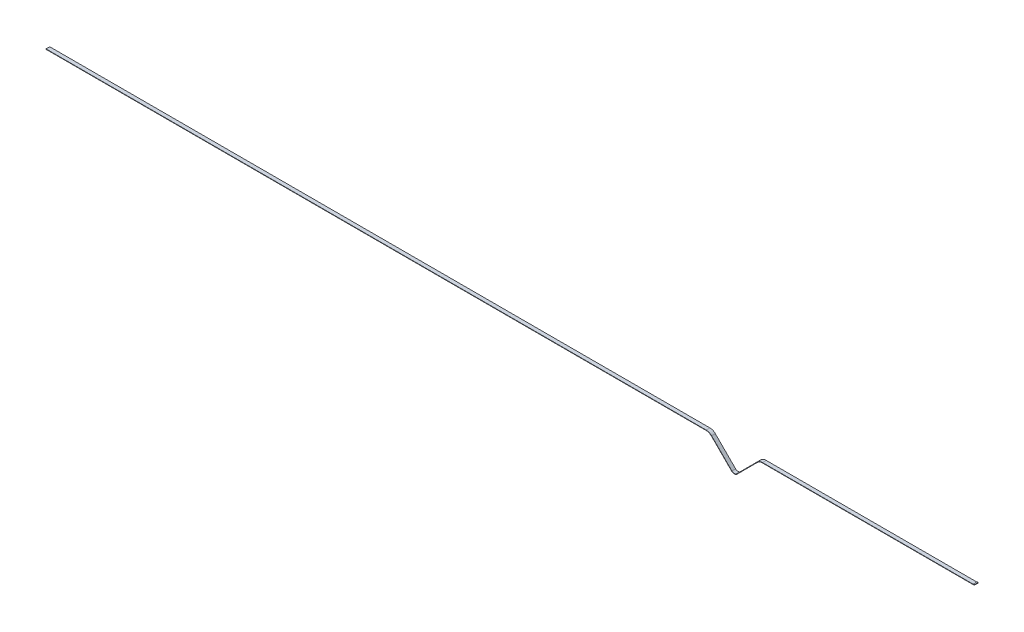
ISO-10303-21;
HEADER;
FILE_DESCRIPTION(('STEP AP214'),'2;1');
FILE_NAME('part.step','',(''),(''),'','','');
FILE_SCHEMA(('AUTOMOTIVE_DESIGN { 1 0 10303 214 1 1 1 1 }'));
ENDSEC;
DATA;
#1=APPLICATION_CONTEXT('core data for automotive mechanical design processes');
#2=APPLICATION_PROTOCOL_DEFINITION('international standard','automotive_design',2000,#1);
#3=PRODUCT_CONTEXT('',#1,'mechanical');
#4=PRODUCT('Part','Part','',(#3));
#5=PRODUCT_RELATED_PRODUCT_CATEGORY('part','',(#4));
#6=PRODUCT_DEFINITION_FORMATION('','',#4);
#7=PRODUCT_DEFINITION_CONTEXT('part definition',#1,'design');
#8=PRODUCT_DEFINITION('design','',#6,#7);
#9=PRODUCT_DEFINITION_SHAPE('','',#8);
#10=(LENGTH_UNIT() NAMED_UNIT(*) SI_UNIT(.MILLI.,.METRE.));
#11=(NAMED_UNIT(*) PLANE_ANGLE_UNIT() SI_UNIT($,.RADIAN.));
#12=(NAMED_UNIT(*) SI_UNIT($,.STERADIAN.) SOLID_ANGLE_UNIT());
#13=UNCERTAINTY_MEASURE_WITH_UNIT(LENGTH_MEASURE(1.E-05),#10,'distance_accuracy_value','');
#14=(GEOMETRIC_REPRESENTATION_CONTEXT(3) GLOBAL_UNCERTAINTY_ASSIGNED_CONTEXT((#13)) GLOBAL_UNIT_ASSIGNED_CONTEXT((#10,
#11,#12)) REPRESENTATION_CONTEXT('',''));
#15=CARTESIAN_POINT('',(0.,0.,0.));
#16=DIRECTION('',(0.,0.,1.));
#17=DIRECTION('',(1.,0.,0.));
#18=AXIS2_PLACEMENT_3D('',#15,#16,#17);
#19=CARTESIAN_POINT('',(0.,0.,0.));
#20=DIRECTION('',(-1.,0.,0.));
#21=DIRECTION('',(0.,0.,1.));
#22=AXIS2_PLACEMENT_3D('',#19,#20,#21);
#23=PLANE('',#22);
#24=DIRECTION('',(0.,-1.,0.));
#25=VECTOR('',#24,1.);
#26=CARTESIAN_POINT('',(0.,0.,0.));
#27=LINE('',#26,#25);
#28=CARTESIAN_POINT('',(0.,0.63,0.));
#29=VERTEX_POINT('',#28);
#30=CARTESIAN_POINT('',(0.,0.,0.));
#31=VERTEX_POINT('',#30);
#32=EDGE_CURVE('E247',#29,#31,#27,.T.);
#33=ORIENTED_EDGE('',*,*,#32,.T.);
#34=DIRECTION('',(0.,0.,-1.));
#35=VECTOR('',#34,1.);
#36=CARTESIAN_POINT('',(0.,0.,0.));
#37=LINE('',#36,#35);
#38=CARTESIAN_POINT('',(0.,0.,-6.));
#39=VERTEX_POINT('',#38);
#40=EDGE_CURVE('E181',#31,#39,#37,.T.);
#41=ORIENTED_EDGE('',*,*,#40,.T.);
#42=DIRECTION('',(0.,1.,0.));
#43=VECTOR('',#42,1.);
#44=CARTESIAN_POINT('',(0.,0.,-6.));
#45=LINE('',#44,#43);
#46=CARTESIAN_POINT('',(0.,0.63,-6.));
#47=VERTEX_POINT('',#46);
#48=EDGE_CURVE('E167',#39,#47,#45,.T.);
#49=ORIENTED_EDGE('',*,*,#48,.T.);
#50=DIRECTION('',(0.,0.,1.));
#51=VECTOR('',#50,1.);
#52=CARTESIAN_POINT('',(0.,0.63,0.));
#53=LINE('',#52,#51);
#54=EDGE_CURVE('E156',#47,#29,#53,.T.);
#55=ORIENTED_EDGE('',*,*,#54,.T.);
#56=EDGE_LOOP('',(#33,#41,#49,#55));
#57=FACE_BOUND('',#56,.T.);
#58=ADVANCED_FACE('F33',(#57),#23,.F.);
#59=CARTESIAN_POINT('',(-1500.,-1.73797688063286E-13,0.));
#60=DIRECTION('',(-1.,0.,0.));
#61=DIRECTION('',(0.,0.,1.));
#62=AXIS2_PLACEMENT_3D('',#59,#60,#61);
#63=PLANE('',#62);
#64=DIRECTION('',(0.,-1.,0.));
#65=VECTOR('',#64,1.);
#66=CARTESIAN_POINT('',(-1500.,-1.73797688063286E-13,0.));
#67=LINE('',#66,#65);
#68=CARTESIAN_POINT('',(-1500.,0.629999999999826,0.));
#69=VERTEX_POINT('',#68);
#70=CARTESIAN_POINT('',(-1500.,-1.73797688063286E-13,0.));
#71=VERTEX_POINT('',#70);
#72=EDGE_CURVE('E55',#69,#71,#67,.T.);
#73=ORIENTED_EDGE('',*,*,#72,.F.);
#74=DIRECTION('',(0.,0.,1.));
#75=VECTOR('',#74,1.);
#76=CARTESIAN_POINT('',(-1500.,0.629999999999826,0.));
#77=LINE('',#76,#75);
#78=CARTESIAN_POINT('',(-1500.,0.629999999999826,-6.));
#79=VERTEX_POINT('',#78);
#80=EDGE_CURVE('E243',#79,#69,#77,.T.);
#81=ORIENTED_EDGE('',*,*,#80,.F.);
#82=DIRECTION('',(0.,1.,0.));
#83=VECTOR('',#82,1.);
#84=CARTESIAN_POINT('',(-1500.,-1.73797688063286E-13,-6.));
#85=LINE('',#84,#83);
#86=CARTESIAN_POINT('',(-1500.,-1.73797688063286E-13,-6.));
#87=VERTEX_POINT('',#86);
#88=EDGE_CURVE('E237',#87,#79,#85,.T.);
#89=ORIENTED_EDGE('',*,*,#88,.F.);
#90=DIRECTION('',(0.,0.,-1.));
#91=VECTOR('',#90,1.);
#92=CARTESIAN_POINT('',(-1500.,-1.73797688063286E-13,0.));
#93=LINE('',#92,#91);
#94=EDGE_CURVE('E11',#71,#87,#93,.T.);
#95=ORIENTED_EDGE('',*,*,#94,.F.);
#96=EDGE_LOOP('',(#73,#81,#89,#95));
#97=FACE_BOUND('',#96,.T.);
#98=ADVANCED_FACE('F367',(#97),#63,.T.);
#99=CARTESIAN_POINT('',(0.,0.,-6.));
#100=DIRECTION('',(0.,0.,1.));
#101=DIRECTION('',(1.,0.,0.));
#102=AXIS2_PLACEMENT_3D('',#99,#100,#101);
#103=PLANE('',#102);
#104=DIRECTION('',(-1.,0.,0.));
#105=VECTOR('',#104,1.);
#106=CARTESIAN_POINT('',(0.,0.63,-6.));
#107=LINE('',#106,#105);
#108=CARTESIAN_POINT('',(-1.5,0.63,-6.));
#109=VERTEX_POINT('',#108);
#110=CARTESIAN_POINT('',(-342.201861120125,0.629999999999958,-6.));
#111=VERTEX_POINT('',#110);
#112=EDGE_CURVE('E164',#109,#111,#107,.T.);
#113=ORIENTED_EDGE('',*,*,#112,.F.);
#114=CARTESIAN_POINT('',(-0.75,0.63,-6.));
#115=DIRECTION('',(0.,0.,1.));
#116=DIRECTION('',(1.,0.,0.));
#117=AXIS2_PLACEMENT_3D('',#114,#115,#116);
#118=CIRCLE('',#117,0.75);
#119=EDGE_CURVE('E150',#47,#109,#118,.T.);
#120=ORIENTED_EDGE('',*,*,#119,.F.);
#121=ORIENTED_EDGE('',*,*,#48,.F.);
#122=DIRECTION('',(-1.,0.,0.));
#123=VECTOR('',#122,1.);
#124=CARTESIAN_POINT('',(0.,0.,-6.));
#125=LINE('',#124,#123);
#126=CARTESIAN_POINT('',(-342.201861120125,0.,-6.));
#127=VERTEX_POINT('',#126);
#128=EDGE_CURVE('E176',#39,#127,#125,.T.);
#129=ORIENTED_EDGE('',*,*,#128,.T.);
#130=DIRECTION('',(0.,1.,0.));
#131=VECTOR('',#130,1.);
#132=CARTESIAN_POINT('',(-342.201861120125,0.,-6.));
#133=LINE('',#132,#131);
#134=EDGE_CURVE('E172',#127,#111,#133,.T.);
#135=ORIENTED_EDGE('',*,*,#134,.T.);
#136=EDGE_LOOP('',(#113,#120,#121,#129,#135));
#137=FACE_BOUND('',#136,.T.);
#138=ADVANCED_FACE('F170',(#137),#103,.F.);
#139=CARTESIAN_POINT('',(0.,0.63,0.));
#140=DIRECTION('',(0.,-1.,0.));
#141=DIRECTION('',(1.,0.,0.));
#142=AXIS2_PLACEMENT_3D('',#139,#140,#141);
#143=PLANE('',#142);
#144=DIRECTION('',(-1.,0.,0.));
#145=VECTOR('',#144,1.);
#146=CARTESIAN_POINT('',(0.,0.63,0.));
#147=LINE('',#146,#145);
#148=CARTESIAN_POINT('',(-1.5,0.63,0.));
#149=VERTEX_POINT('',#148);
#150=CARTESIAN_POINT('',(-342.201861120125,0.629999999999958,0.));
#151=VERTEX_POINT('',#150);
#152=EDGE_CURVE('E166',#149,#151,#147,.T.);
#153=ORIENTED_EDGE('',*,*,#152,.F.);
#154=DIRECTION('',(0.,0.,1.));
#155=VECTOR('',#154,1.);
#156=CARTESIAN_POINT('',(-1.5,0.63,-6.));
#157=LINE('',#156,#155);
#158=EDGE_CURVE('E153',#109,#149,#157,.T.);
#159=ORIENTED_EDGE('',*,*,#158,.F.);
#160=ORIENTED_EDGE('',*,*,#112,.T.);
#161=DIRECTION('',(0.,0.,1.));
#162=VECTOR('',#161,1.);
#163=CARTESIAN_POINT('',(-342.201861120125,0.629999999999958,0.));
#164=LINE('',#163,#162);
#165=EDGE_CURVE('E173',#111,#151,#164,.T.);
#166=ORIENTED_EDGE('',*,*,#165,.T.);
#167=EDGE_LOOP('',(#153,#159,#160,#166));
#168=FACE_BOUND('',#167,.T.);
#169=ADVANCED_FACE('F162',(#168),#143,.F.);
#170=CARTESIAN_POINT('',(0.,0.,0.));
#171=DIRECTION('',(0.,0.,-1.));
#172=DIRECTION('',(-1.,0.,0.));
#173=AXIS2_PLACEMENT_3D('',#170,#171,#172);
#174=PLANE('',#173);
#175=DIRECTION('',(0.,-1.,0.));
#176=VECTOR('',#175,1.);
#177=CARTESIAN_POINT('',(-342.201861120125,0.,0.));
#178=LINE('',#177,#176);
#179=CARTESIAN_POINT('',(-342.201861120125,0.,0.));
#180=VERTEX_POINT('',#179);
#181=EDGE_CURVE('E250',#151,#180,#178,.T.);
#182=ORIENTED_EDGE('',*,*,#181,.T.);
#183=DIRECTION('',(-1.,0.,0.));
#184=VECTOR('',#183,1.);
#185=CARTESIAN_POINT('',(0.,0.,0.));
#186=LINE('',#185,#184);
#187=EDGE_CURVE('E288',#31,#180,#186,.T.);
#188=ORIENTED_EDGE('',*,*,#187,.F.);
#189=ORIENTED_EDGE('',*,*,#32,.F.);
#190=CARTESIAN_POINT('',(-0.75,0.63,0.));
#191=DIRECTION('',(0.,0.,1.));
#192=DIRECTION('',(1.,0.,0.));
#193=AXIS2_PLACEMENT_3D('',#190,#191,#192);
#194=CIRCLE('',#193,0.75);
#195=EDGE_CURVE('E47',#29,#149,#194,.T.);
#196=ORIENTED_EDGE('',*,*,#195,.T.);
#197=ORIENTED_EDGE('',*,*,#152,.T.);
#198=EDGE_LOOP('',(#182,#188,#189,#196,#197));
#199=FACE_BOUND('',#198,.T.);
#200=ADVANCED_FACE('F415',(#199),#174,.F.);
#201=CARTESIAN_POINT('',(0.,0.,0.));
#202=DIRECTION('',(0.,1.,0.));
#203=DIRECTION('',(-1.,0.,0.));
#204=AXIS2_PLACEMENT_3D('',#201,#202,#203);
#205=PLANE('',#204);
#206=DIRECTION('',(0.,0.,-1.));
#207=VECTOR('',#206,1.);
#208=CARTESIAN_POINT('',(-342.201861120125,0.,0.));
#209=LINE('',#208,#207);
#210=EDGE_CURVE('E192',#180,#127,#209,.T.);
#211=ORIENTED_EDGE('',*,*,#210,.T.);
#212=ORIENTED_EDGE('',*,*,#128,.F.);
#213=ORIENTED_EDGE('',*,*,#40,.F.);
#214=ORIENTED_EDGE('',*,*,#187,.T.);
#215=EDGE_LOOP('',(#211,#212,#213,#214));
#216=FACE_BOUND('',#215,.T.);
#217=ADVANCED_FACE('F408',(#216),#205,.F.);
#218=CARTESIAN_POINT('',(-342.201861120126,0.,-6.));
#219=DIRECTION('',(0.,0.,1.));
#220=DIRECTION('',(1.,0.,0.));
#221=AXIS2_PLACEMENT_3D('',#218,#219,#220);
#222=PLANE('',#221);
#223=CARTESIAN_POINT('',(-342.201861120126,-11.9499999999934,-6.));
#224=DIRECTION('',(0.,0.,1.));
#225=DIRECTION('',(0.,1.,0.));
#226=AXIS2_PLACEMENT_3D('',#223,#224,#225);
#227=CIRCLE('',#226,12.5799999999933);
#228=CARTESIAN_POINT('',(-351.10277855022,-3.06011423568368,-6.));
#229=VERTEX_POINT('',#228);
#230=EDGE_CURVE('E185',#111,#229,#227,.T.);
#231=ORIENTED_EDGE('',*,*,#230,.F.);
#232=ORIENTED_EDGE('',*,*,#134,.F.);
#233=CARTESIAN_POINT('',(-342.201861120126,-11.9499999999934,-6.));
#234=DIRECTION('',(0.,0.,1.));
#235=DIRECTION('',(0.,1.,0.));
#236=AXIS2_PLACEMENT_3D('',#233,#234,#235);
#237=CIRCLE('',#236,11.9499999999933);
#238=CARTESIAN_POINT('',(-350.657025133609,-3.50531519208416,-6.));
#239=VERTEX_POINT('',#238);
#240=EDGE_CURVE('E186',#127,#239,#237,.T.);
#241=ORIENTED_EDGE('',*,*,#240,.T.);
#242=DIRECTION('',(-0.707545105731241,0.70666818476267,0.));
#243=VECTOR('',#242,1.);
#244=CARTESIAN_POINT('',(-350.657025133609,-3.50531519208416,-6.));
#245=LINE('',#244,#243);
#246=EDGE_CURVE('E182',#239,#229,#245,.T.);
#247=ORIENTED_EDGE('',*,*,#246,.T.);
#248=EDGE_LOOP('',(#231,#232,#241,#247));
#249=FACE_BOUND('',#248,.T.);
#250=ADVANCED_FACE('F406',(#249),#222,.F.);
#251=CARTESIAN_POINT('',(-342.201861120126,-11.9499999999934,0.));
#252=DIRECTION('',(0.,0.,1.));
#253=DIRECTION('',(1.,0.,0.));
#254=AXIS2_PLACEMENT_3D('',#251,#252,#253);
#255=CYLINDRICAL_SURFACE('',#254,12.5799999999933);
#256=CARTESIAN_POINT('',(-342.201861120126,-11.9499999999934,0.));
#257=DIRECTION('',(0.,0.,1.));
#258=DIRECTION('',(0.,1.,0.));
#259=AXIS2_PLACEMENT_3D('',#256,#257,#258);
#260=CIRCLE('',#259,12.5799999999933);
#261=CARTESIAN_POINT('',(-351.10277855022,-3.06011423568368,0.));
#262=VERTEX_POINT('',#261);
#263=EDGE_CURVE('E253',#151,#262,#260,.T.);
#264=ORIENTED_EDGE('',*,*,#263,.F.);
#265=ORIENTED_EDGE('',*,*,#165,.F.);
#266=ORIENTED_EDGE('',*,*,#230,.T.);
#267=DIRECTION('',(0.,0.,1.));
#268=VECTOR('',#267,1.);
#269=CARTESIAN_POINT('',(-351.10277855022,-3.06011423568367,0.));
#270=LINE('',#269,#268);
#271=EDGE_CURVE('E189',#229,#262,#270,.T.);
#272=ORIENTED_EDGE('',*,*,#271,.T.);
#273=EDGE_LOOP('',(#264,#265,#266,#272));
#274=FACE_BOUND('',#273,.T.);
#275=ADVANCED_FACE('F404',(#274),#255,.T.);
#276=CARTESIAN_POINT('',(-342.201861120126,0.,0.));
#277=DIRECTION('',(0.,0.,-1.));
#278=DIRECTION('',(-1.,0.,0.));
#279=AXIS2_PLACEMENT_3D('',#276,#277,#278);
#280=PLANE('',#279);
#281=CARTESIAN_POINT('',(-342.201861120126,-11.9499999999934,0.));
#282=DIRECTION('',(0.,0.,1.));
#283=DIRECTION('',(0.,1.,0.));
#284=AXIS2_PLACEMENT_3D('',#281,#282,#283);
#285=CIRCLE('',#284,11.9499999999933);
#286=CARTESIAN_POINT('',(-350.657025133609,-3.50531519208416,0.));
#287=VERTEX_POINT('',#286);
#288=EDGE_CURVE('E292',#180,#287,#285,.T.);
#289=ORIENTED_EDGE('',*,*,#288,.F.);
#290=ORIENTED_EDGE('',*,*,#181,.F.);
#291=ORIENTED_EDGE('',*,*,#263,.T.);
#292=DIRECTION('',(0.707545105731241,-0.70666818476267,0.));
#293=VECTOR('',#292,1.);
#294=CARTESIAN_POINT('',(-350.657025133609,-3.50531519208416,0.));
#295=LINE('',#294,#293);
#296=EDGE_CURVE('E256',#262,#287,#295,.T.);
#297=ORIENTED_EDGE('',*,*,#296,.T.);
#298=EDGE_LOOP('',(#289,#290,#291,#297));
#299=FACE_BOUND('',#298,.T.);
#300=ADVANCED_FACE('F395',(#299),#280,.F.);
#301=CARTESIAN_POINT('',(-342.201861120126,-11.9499999999934,0.));
#302=DIRECTION('',(0.,0.,1.));
#303=DIRECTION('',(1.,0.,0.));
#304=AXIS2_PLACEMENT_3D('',#301,#302,#303);
#305=CYLINDRICAL_SURFACE('',#304,11.9499999999933);
#306=DIRECTION('',(0.,0.,-1.));
#307=VECTOR('',#306,1.);
#308=CARTESIAN_POINT('',(-350.657025133609,-3.50531519208416,0.));
#309=LINE('',#308,#307);
#310=EDGE_CURVE('E203',#287,#239,#309,.T.);
#311=ORIENTED_EDGE('',*,*,#310,.T.);
#312=ORIENTED_EDGE('',*,*,#240,.F.);
#313=ORIENTED_EDGE('',*,*,#210,.F.);
#314=ORIENTED_EDGE('',*,*,#288,.T.);
#315=EDGE_LOOP('',(#311,#312,#313,#314));
#316=FACE_BOUND('',#315,.T.);
#317=ADVANCED_FACE('F389',(#316),#305,.F.);
#318=CARTESIAN_POINT('',(-350.657025133609,-3.50531519208414,-6.));
#319=DIRECTION('',(0.,0.,1.));
#320=DIRECTION('',(1.,0.,0.));
#321=AXIS2_PLACEMENT_3D('',#318,#319,#320);
#322=PLANE('',#321);
#323=DIRECTION('',(-0.706668184762671,-0.70754510573124,0.));
#324=VECTOR('',#323,1.);
#325=CARTESIAN_POINT('',(-351.10277855022,-3.06011423568366,-6.));
#326=LINE('',#325,#324);
#327=CARTESIAN_POINT('',(-383.89451394072,-35.8925416524838,-6.));
#328=VERTEX_POINT('',#327);
#329=EDGE_CURVE('E196',#229,#328,#326,.T.);
#330=ORIENTED_EDGE('',*,*,#329,.F.);
#331=ORIENTED_EDGE('',*,*,#246,.F.);
#332=DIRECTION('',(-0.706668184762671,-0.70754510573124,0.));
#333=VECTOR('',#332,1.);
#334=CARTESIAN_POINT('',(-350.657025133609,-3.50531519208414,-6.));
#335=LINE('',#334,#333);
#336=CARTESIAN_POINT('',(-383.448760524109,-36.3377426088843,-6.));
#337=VERTEX_POINT('',#336);
#338=EDGE_CURVE('E197',#239,#337,#335,.T.);
#339=ORIENTED_EDGE('',*,*,#338,.T.);
#340=DIRECTION('',(-0.70754510573124,0.706668184762671,0.));
#341=VECTOR('',#340,1.);
#342=CARTESIAN_POINT('',(-383.448760524109,-36.3377426088843,-6.));
#343=LINE('',#342,#341);
#344=EDGE_CURVE('E193',#337,#328,#343,.T.);
#345=ORIENTED_EDGE('',*,*,#344,.T.);
#346=EDGE_LOOP('',(#330,#331,#339,#345));
#347=FACE_BOUND('',#346,.T.);
#348=ADVANCED_FACE('F383',(#347),#322,.F.);
#349=CARTESIAN_POINT('',(-351.10277855022,-3.06011423568366,0.));
#350=DIRECTION('',(0.707545105731241,-0.706668184762671,0.));
#351=DIRECTION('',(0.706668184762671,0.70754510573124,0.));
#352=AXIS2_PLACEMENT_3D('',#349,#350,#351);
#353=PLANE('',#352);
#354=DIRECTION('',(-0.706668184762671,-0.70754510573124,0.));
#355=VECTOR('',#354,1.);
#356=CARTESIAN_POINT('',(-351.10277855022,-3.06011423568366,0.));
#357=LINE('',#356,#355);
#358=CARTESIAN_POINT('',(-383.89451394072,-35.8925416524838,0.));
#359=VERTEX_POINT('',#358);
#360=EDGE_CURVE('E259',#262,#359,#357,.T.);
#361=ORIENTED_EDGE('',*,*,#360,.F.);
#362=ORIENTED_EDGE('',*,*,#271,.F.);
#363=ORIENTED_EDGE('',*,*,#329,.T.);
#364=DIRECTION('',(0.,0.,1.));
#365=VECTOR('',#364,1.);
#366=CARTESIAN_POINT('',(-383.89451394072,-35.8925416524838,0.));
#367=LINE('',#366,#365);
#368=EDGE_CURVE('E200',#328,#359,#367,.T.);
#369=ORIENTED_EDGE('',*,*,#368,.T.);
#370=EDGE_LOOP('',(#361,#362,#363,#369));
#371=FACE_BOUND('',#370,.T.);
#372=ADVANCED_FACE('F401',(#371),#353,.F.);
#373=CARTESIAN_POINT('',(-350.657025133609,-3.50531519208414,0.));
#374=DIRECTION('',(0.,0.,-1.));
#375=DIRECTION('',(-1.,0.,0.));
#376=AXIS2_PLACEMENT_3D('',#373,#374,#375);
#377=PLANE('',#376);
#378=DIRECTION('',(-0.706668184762671,-0.70754510573124,0.));
#379=VECTOR('',#378,1.);
#380=CARTESIAN_POINT('',(-350.657025133609,-3.50531519208414,0.));
#381=LINE('',#380,#379);
#382=CARTESIAN_POINT('',(-383.448760524109,-36.3377426088843,0.));
#383=VERTEX_POINT('',#382);
#384=EDGE_CURVE('E297',#287,#383,#381,.T.);
#385=ORIENTED_EDGE('',*,*,#384,.F.);
#386=ORIENTED_EDGE('',*,*,#296,.F.);
#387=ORIENTED_EDGE('',*,*,#360,.T.);
#388=DIRECTION('',(0.70754510573124,-0.706668184762671,0.));
#389=VECTOR('',#388,1.);
#390=CARTESIAN_POINT('',(-383.448760524109,-36.3377426088843,0.));
#391=LINE('',#390,#389);
#392=EDGE_CURVE('E262',#359,#383,#391,.T.);
#393=ORIENTED_EDGE('',*,*,#392,.T.);
#394=EDGE_LOOP('',(#385,#386,#387,#393));
#395=FACE_BOUND('',#394,.T.);
#396=ADVANCED_FACE('F398',(#395),#377,.F.);
#397=CARTESIAN_POINT('',(-350.657025133609,-3.50531519208414,0.));
#398=DIRECTION('',(-0.707545105731241,0.706668184762671,0.));
#399=DIRECTION('',(-0.706668184762671,-0.70754510573124,0.));
#400=AXIS2_PLACEMENT_3D('',#397,#398,#399);
#401=PLANE('',#400);
#402=DIRECTION('',(0.,0.,-1.));
#403=VECTOR('',#402,1.);
#404=CARTESIAN_POINT('',(-383.448760524109,-36.3377426088843,0.));
#405=LINE('',#404,#403);
#406=EDGE_CURVE('E214',#383,#337,#405,.T.);
#407=ORIENTED_EDGE('',*,*,#406,.T.);
#408=ORIENTED_EDGE('',*,*,#338,.F.);
#409=ORIENTED_EDGE('',*,*,#310,.F.);
#410=ORIENTED_EDGE('',*,*,#384,.T.);
#411=EDGE_LOOP('',(#407,#408,#409,#410));
#412=FACE_BOUND('',#411,.T.);
#413=ADVANCED_FACE('F386',(#412),#401,.F.);
#414=CARTESIAN_POINT('',(-383.448760524109,-36.3377426088843,-6.));
#415=DIRECTION('',(0.,0.,1.));
#416=DIRECTION('',(1.,0.,0.));
#417=AXIS2_PLACEMENT_3D('',#414,#415,#416);
#418=PLANE('',#417);
#419=CARTESIAN_POINT('',(-387.771861120127,-32.0199999999844,-6.));
#420=DIRECTION('',(0.,0.,-1.));
#421=DIRECTION('',(0.707545105731238,-0.706668184762673,0.));
#422=AXIS2_PLACEMENT_3D('',#419,#420,#421);
#423=CIRCLE('',#422,5.48);
#424=CARTESIAN_POINT('',(-391.649208299535,-35.8925416524836,-6.));
#425=VERTEX_POINT('',#424);
#426=EDGE_CURVE('E207',#328,#425,#423,.T.);
#427=ORIENTED_EDGE('',*,*,#426,.F.);
#428=ORIENTED_EDGE('',*,*,#344,.F.);
#429=CARTESIAN_POINT('',(-387.771861120127,-32.0199999999844,-6.));
#430=DIRECTION('',(0.,0.,-1.));
#431=DIRECTION('',(0.707545105731238,-0.706668184762673,0.));
#432=AXIS2_PLACEMENT_3D('',#429,#430,#431);
#433=CIRCLE('',#432,6.11000000000001);
#434=CARTESIAN_POINT('',(-392.094961716145,-36.337742608884,-6.));
#435=VERTEX_POINT('',#434);
#436=EDGE_CURVE('E208',#337,#435,#433,.T.);
#437=ORIENTED_EDGE('',*,*,#436,.T.);
#438=DIRECTION('',(0.707545105731281,0.706668184762629,0.));
#439=VECTOR('',#438,1.);
#440=CARTESIAN_POINT('',(-392.094961716145,-36.3377426088841,-6.));
#441=LINE('',#440,#439);
#442=EDGE_CURVE('E204',#435,#425,#441,.T.);
#443=ORIENTED_EDGE('',*,*,#442,.T.);
#444=EDGE_LOOP('',(#427,#428,#437,#443));
#445=FACE_BOUND('',#444,.T.);
#446=ADVANCED_FACE('F380',(#445),#418,.F.);
#447=CARTESIAN_POINT('',(-387.771861120127,-32.0199999999844,0.));
#448=DIRECTION('',(0.,0.,-1.));
#449=DIRECTION('',(-1.,0.,0.));
#450=AXIS2_PLACEMENT_3D('',#447,#448,#449);
#451=CYLINDRICAL_SURFACE('',#450,5.48);
#452=CARTESIAN_POINT('',(-387.771861120127,-32.0199999999844,0.));
#453=DIRECTION('',(0.,0.,-1.));
#454=DIRECTION('',(0.707545105731238,-0.706668184762673,0.));
#455=AXIS2_PLACEMENT_3D('',#452,#453,#454);
#456=CIRCLE('',#455,5.48);
#457=CARTESIAN_POINT('',(-391.649208299535,-35.8925416524836,0.));
#458=VERTEX_POINT('',#457);
#459=EDGE_CURVE('E265',#359,#458,#456,.T.);
#460=ORIENTED_EDGE('',*,*,#459,.F.);
#461=ORIENTED_EDGE('',*,*,#368,.F.);
#462=ORIENTED_EDGE('',*,*,#426,.T.);
#463=DIRECTION('',(0.,0.,1.));
#464=VECTOR('',#463,1.);
#465=CARTESIAN_POINT('',(-391.649208299535,-35.8925416524836,0.));
#466=LINE('',#465,#464);
#467=EDGE_CURVE('E211',#425,#458,#466,.T.);
#468=ORIENTED_EDGE('',*,*,#467,.T.);
#469=EDGE_LOOP('',(#460,#461,#462,#468));
#470=FACE_BOUND('',#469,.T.);
#471=ADVANCED_FACE('F377',(#470),#451,.F.);
#472=CARTESIAN_POINT('',(-383.448760524109,-36.3377426088843,0.));
#473=DIRECTION('',(0.,0.,-1.));
#474=DIRECTION('',(-1.,0.,0.));
#475=AXIS2_PLACEMENT_3D('',#472,#473,#474);
#476=PLANE('',#475);
#477=CARTESIAN_POINT('',(-387.771861120127,-32.0199999999844,0.));
#478=DIRECTION('',(0.,0.,-1.));
#479=DIRECTION('',(0.707545105731238,-0.706668184762673,0.));
#480=AXIS2_PLACEMENT_3D('',#477,#478,#479);
#481=CIRCLE('',#480,6.11000000000001);
#482=CARTESIAN_POINT('',(-392.094961716145,-36.337742608884,0.));
#483=VERTEX_POINT('',#482);
#484=EDGE_CURVE('E302',#383,#483,#481,.T.);
#485=ORIENTED_EDGE('',*,*,#484,.F.);
#486=ORIENTED_EDGE('',*,*,#392,.F.);
#487=ORIENTED_EDGE('',*,*,#459,.T.);
#488=DIRECTION('',(-0.707545105731281,-0.706668184762629,0.));
#489=VECTOR('',#488,1.);
#490=CARTESIAN_POINT('',(-392.094961716145,-36.3377426088841,0.));
#491=LINE('',#490,#489);
#492=EDGE_CURVE('E268',#458,#483,#491,.T.);
#493=ORIENTED_EDGE('',*,*,#492,.T.);
#494=EDGE_LOOP('',(#485,#486,#487,#493));
#495=FACE_BOUND('',#494,.T.);
#496=ADVANCED_FACE('F355',(#495),#476,.F.);
#497=CARTESIAN_POINT('',(-387.771861120127,-32.0199999999844,0.));
#498=DIRECTION('',(0.,0.,-1.));
#499=DIRECTION('',(-1.,0.,0.));
#500=AXIS2_PLACEMENT_3D('',#497,#498,#499);
#501=CYLINDRICAL_SURFACE('',#500,6.11000000000001);
#502=DIRECTION('',(0.,0.,-1.));
#503=VECTOR('',#502,1.);
#504=CARTESIAN_POINT('',(-392.094961716145,-36.3377426088841,0.));
#505=LINE('',#504,#503);
#506=EDGE_CURVE('E225',#483,#435,#505,.T.);
#507=ORIENTED_EDGE('',*,*,#506,.T.);
#508=ORIENTED_EDGE('',*,*,#436,.F.);
#509=ORIENTED_EDGE('',*,*,#406,.F.);
#510=ORIENTED_EDGE('',*,*,#484,.T.);
#511=EDGE_LOOP('',(#507,#508,#509,#510));
#512=FACE_BOUND('',#511,.T.);
#513=ADVANCED_FACE('F350',(#512),#501,.T.);
#514=CARTESIAN_POINT('',(-392.094961716145,-36.3377426088841,-6.));
#515=DIRECTION('',(0.,0.,1.));
#516=DIRECTION('',(1.,0.,0.));
#517=AXIS2_PLACEMENT_3D('',#514,#515,#516);
#518=PLANE('',#517);
#519=DIRECTION('',(-0.706668184762635,0.707545105731276,0.));
#520=VECTOR('',#519,1.);
#521=CARTESIAN_POINT('',(-391.649208299535,-35.8925416524836,-6.));
#522=LINE('',#521,#520);
#523=CARTESIAN_POINT('',(-424.440943690031,-3.06011423568413,-6.));
#524=VERTEX_POINT('',#523);
#525=EDGE_CURVE('E218',#425,#524,#522,.T.);
#526=ORIENTED_EDGE('',*,*,#525,.F.);
#527=ORIENTED_EDGE('',*,*,#442,.F.);
#528=DIRECTION('',(-0.706668184762635,0.707545105731276,0.));
#529=VECTOR('',#528,1.);
#530=CARTESIAN_POINT('',(-392.094961716145,-36.3377426088841,-6.));
#531=LINE('',#530,#529);
#532=CARTESIAN_POINT('',(-424.886697106642,-3.50531519208459,-6.));
#533=VERTEX_POINT('',#532);
#534=EDGE_CURVE('E219',#435,#533,#531,.T.);
#535=ORIENTED_EDGE('',*,*,#534,.T.);
#536=DIRECTION('',(0.707545105731276,0.706668184762635,0.));
#537=VECTOR('',#536,1.);
#538=CARTESIAN_POINT('',(-424.886697106642,-3.5053151920846,-6.));
#539=LINE('',#538,#537);
#540=EDGE_CURVE('E215',#533,#524,#539,.T.);
#541=ORIENTED_EDGE('',*,*,#540,.T.);
#542=EDGE_LOOP('',(#526,#527,#535,#541));
#543=FACE_BOUND('',#542,.T.);
#544=ADVANCED_FACE('F345',(#543),#518,.F.);
#545=CARTESIAN_POINT('',(-391.649208299535,-35.8925416524836,0.));
#546=DIRECTION('',(-0.707545105731276,-0.706668184762634,0.));
#547=DIRECTION('',(0.706668184762635,-0.707545105731276,0.));
#548=AXIS2_PLACEMENT_3D('',#545,#546,#547);
#549=PLANE('',#548);
#550=DIRECTION('',(-0.706668184762635,0.707545105731276,0.));
#551=VECTOR('',#550,1.);
#552=CARTESIAN_POINT('',(-391.649208299535,-35.8925416524836,0.));
#553=LINE('',#552,#551);
#554=CARTESIAN_POINT('',(-424.440943690031,-3.06011423568413,0.));
#555=VERTEX_POINT('',#554);
#556=EDGE_CURVE('E271',#458,#555,#553,.T.);
#557=ORIENTED_EDGE('',*,*,#556,.F.);
#558=ORIENTED_EDGE('',*,*,#467,.F.);
#559=ORIENTED_EDGE('',*,*,#525,.T.);
#560=DIRECTION('',(0.,0.,1.));
#561=VECTOR('',#560,1.);
#562=CARTESIAN_POINT('',(-424.440943690031,-3.06011423568414,0.));
#563=LINE('',#562,#561);
#564=EDGE_CURVE('E222',#524,#555,#563,.T.);
#565=ORIENTED_EDGE('',*,*,#564,.T.);
#566=EDGE_LOOP('',(#557,#558,#559,#565));
#567=FACE_BOUND('',#566,.T.);
#568=ADVANCED_FACE('F374',(#567),#549,.F.);
#569=CARTESIAN_POINT('',(-392.094961716145,-36.3377426088841,0.));
#570=DIRECTION('',(0.,0.,-1.));
#571=DIRECTION('',(-1.,0.,0.));
#572=AXIS2_PLACEMENT_3D('',#569,#570,#571);
#573=PLANE('',#572);
#574=DIRECTION('',(-0.706668184762635,0.707545105731276,0.));
#575=VECTOR('',#574,1.);
#576=CARTESIAN_POINT('',(-392.094961716145,-36.3377426088841,0.));
#577=LINE('',#576,#575);
#578=CARTESIAN_POINT('',(-424.886697106642,-3.50531519208459,0.));
#579=VERTEX_POINT('',#578);
#580=EDGE_CURVE('E307',#483,#579,#577,.T.);
#581=ORIENTED_EDGE('',*,*,#580,.F.);
#582=ORIENTED_EDGE('',*,*,#492,.F.);
#583=ORIENTED_EDGE('',*,*,#556,.T.);
#584=DIRECTION('',(-0.707545105731276,-0.706668184762635,0.));
#585=VECTOR('',#584,1.);
#586=CARTESIAN_POINT('',(-424.886697106642,-3.5053151920846,0.));
#587=LINE('',#586,#585);
#588=EDGE_CURVE('E274',#555,#579,#587,.T.);
#589=ORIENTED_EDGE('',*,*,#588,.T.);
#590=EDGE_LOOP('',(#581,#582,#583,#589));
#591=FACE_BOUND('',#590,.T.);
#592=ADVANCED_FACE('F357',(#591),#573,.F.);
#593=CARTESIAN_POINT('',(-392.094961716145,-36.3377426088841,0.));
#594=DIRECTION('',(0.707545105731276,0.706668184762634,0.));
#595=DIRECTION('',(-0.706668184762635,0.707545105731276,0.));
#596=AXIS2_PLACEMENT_3D('',#593,#594,#595);
#597=PLANE('',#596);
#598=DIRECTION('',(0.,0.,-1.));
#599=VECTOR('',#598,1.);
#600=CARTESIAN_POINT('',(-424.886697106642,-3.5053151920846,0.));
#601=LINE('',#600,#599);
#602=EDGE_CURVE('E236',#579,#533,#601,.T.);
#603=ORIENTED_EDGE('',*,*,#602,.T.);
#604=ORIENTED_EDGE('',*,*,#534,.F.);
#605=ORIENTED_EDGE('',*,*,#506,.F.);
#606=ORIENTED_EDGE('',*,*,#580,.T.);
#607=EDGE_LOOP('',(#603,#604,#605,#606));
#608=FACE_BOUND('',#607,.T.);
#609=ADVANCED_FACE('F348',(#608),#597,.F.);
#610=CARTESIAN_POINT('',(-424.886697106642,-3.50531519208461,-6.));
#611=DIRECTION('',(0.,0.,1.));
#612=DIRECTION('',(1.,0.,0.));
#613=AXIS2_PLACEMENT_3D('',#610,#611,#612);
#614=PLANE('',#613);
#615=CARTESIAN_POINT('',(-433.341861120126,-11.9499999999935,-6.));
#616=DIRECTION('',(0.,0.,1.));
#617=DIRECTION('',(0.707545105731274,0.706668184762637,0.));
#618=AXIS2_PLACEMENT_3D('',#615,#616,#617);
#619=CIRCLE('',#618,12.5799999999935);
#620=CARTESIAN_POINT('',(-433.341861120126,0.629999999999962,-6.));
#621=VERTEX_POINT('',#620);
#622=EDGE_CURVE('E229',#524,#621,#619,.T.);
#623=ORIENTED_EDGE('',*,*,#622,.F.);
#624=ORIENTED_EDGE('',*,*,#540,.F.);
#625=CARTESIAN_POINT('',(-433.341861120126,-11.9499999999935,-6.));
#626=DIRECTION('',(0.,0.,1.));
#627=DIRECTION('',(0.707545105731275,0.706668184762636,0.));
#628=AXIS2_PLACEMENT_3D('',#625,#626,#627);
#629=CIRCLE('',#628,11.9499999999935);
#630=CARTESIAN_POINT('',(-433.341861120126,0.,-6.));
#631=VERTEX_POINT('',#630);
#632=EDGE_CURVE('E230',#533,#631,#629,.T.);
#633=ORIENTED_EDGE('',*,*,#632,.T.);
#634=DIRECTION('',(0.,1.,0.));
#635=VECTOR('',#634,1.);
#636=CARTESIAN_POINT('',(-433.341861120126,0.,-6.));
#637=LINE('',#636,#635);
#638=EDGE_CURVE('E226',#631,#621,#637,.T.);
#639=ORIENTED_EDGE('',*,*,#638,.T.);
#640=EDGE_LOOP('',(#623,#624,#633,#639));
#641=FACE_BOUND('',#640,.T.);
#642=ADVANCED_FACE('F341',(#641),#614,.F.);
#643=CARTESIAN_POINT('',(-433.341861120126,-11.9499999999935,0.));
#644=DIRECTION('',(0.,0.,1.));
#645=DIRECTION('',(1.,0.,0.));
#646=AXIS2_PLACEMENT_3D('',#643,#644,#645);
#647=CYLINDRICAL_SURFACE('',#646,12.5799999999935);
#648=CARTESIAN_POINT('',(-433.341861120126,-11.9499999999935,0.));
#649=DIRECTION('',(0.,0.,1.));
#650=DIRECTION('',(0.707545105731274,0.706668184762637,0.));
#651=AXIS2_PLACEMENT_3D('',#648,#649,#650);
#652=CIRCLE('',#651,12.5799999999935);
#653=CARTESIAN_POINT('',(-433.341861120126,0.629999999999962,0.));
#654=VERTEX_POINT('',#653);
#655=EDGE_CURVE('E277',#555,#654,#652,.T.);
#656=ORIENTED_EDGE('',*,*,#655,.F.);
#657=ORIENTED_EDGE('',*,*,#564,.F.);
#658=ORIENTED_EDGE('',*,*,#622,.T.);
#659=DIRECTION('',(0.,0.,1.));
#660=VECTOR('',#659,1.);
#661=CARTESIAN_POINT('',(-433.341861120126,0.629999999999967,0.));
#662=LINE('',#661,#660);
#663=EDGE_CURVE('E233',#621,#654,#662,.T.);
#664=ORIENTED_EDGE('',*,*,#663,.T.);
#665=EDGE_LOOP('',(#656,#657,#658,#664));
#666=FACE_BOUND('',#665,.T.);
#667=ADVANCED_FACE('F371',(#666),#647,.T.);
#668=CARTESIAN_POINT('',(-424.886697106642,-3.50531519208461,0.));
#669=DIRECTION('',(0.,0.,-1.));
#670=DIRECTION('',(-1.,0.,0.));
#671=AXIS2_PLACEMENT_3D('',#668,#669,#670);
#672=PLANE('',#671);
#673=CARTESIAN_POINT('',(-433.341861120126,-11.9499999999935,0.));
#674=DIRECTION('',(0.,0.,1.));
#675=DIRECTION('',(0.707545105731275,0.706668184762636,0.));
#676=AXIS2_PLACEMENT_3D('',#673,#674,#675);
#677=CIRCLE('',#676,11.9499999999935);
#678=CARTESIAN_POINT('',(-433.341861120126,0.,0.));
#679=VERTEX_POINT('',#678);
#680=EDGE_CURVE('E312',#579,#679,#677,.T.);
#681=ORIENTED_EDGE('',*,*,#680,.F.);
#682=ORIENTED_EDGE('',*,*,#588,.F.);
#683=ORIENTED_EDGE('',*,*,#655,.T.);
#684=DIRECTION('',(0.,-1.,0.));
#685=VECTOR('',#684,1.);
#686=CARTESIAN_POINT('',(-433.341861120126,0.,0.));
#687=LINE('',#686,#685);
#688=EDGE_CURVE('E280',#654,#679,#687,.T.);
#689=ORIENTED_EDGE('',*,*,#688,.T.);
#690=EDGE_LOOP('',(#681,#682,#683,#689));
#691=FACE_BOUND('',#690,.T.);
#692=ADVANCED_FACE('F360',(#691),#672,.F.);
#693=CARTESIAN_POINT('',(-433.341861120126,-11.9499999999935,0.));
#694=DIRECTION('',(0.,0.,1.));
#695=DIRECTION('',(1.,0.,0.));
#696=AXIS2_PLACEMENT_3D('',#693,#694,#695);
#697=CYLINDRICAL_SURFACE('',#696,11.9499999999935);
#698=DIRECTION('',(0.,0.,-1.));
#699=VECTOR('',#698,1.);
#700=CARTESIAN_POINT('',(-433.341861120126,0.,0.));
#701=LINE('',#700,#699);
#702=EDGE_CURVE('E246',#679,#631,#701,.T.);
#703=ORIENTED_EDGE('',*,*,#702,.T.);
#704=ORIENTED_EDGE('',*,*,#632,.F.);
#705=ORIENTED_EDGE('',*,*,#602,.F.);
#706=ORIENTED_EDGE('',*,*,#680,.T.);
#707=EDGE_LOOP('',(#703,#704,#705,#706));
#708=FACE_BOUND('',#707,.T.);
#709=ADVANCED_FACE('F333',(#708),#697,.F.);
#710=CARTESIAN_POINT('',(-433.341861120126,0.,-6.));
#711=DIRECTION('',(0.,0.,1.));
#712=DIRECTION('',(1.,0.,0.));
#713=AXIS2_PLACEMENT_3D('',#710,#711,#712);
#714=PLANE('',#713);
#715=DIRECTION('',(-1.,0.,0.));
#716=VECTOR('',#715,1.);
#717=CARTESIAN_POINT('',(-433.341861120126,0.629999999999946,-6.));
#718=LINE('',#717,#716);
#719=EDGE_CURVE('E239',#621,#79,#718,.T.);
#720=ORIENTED_EDGE('',*,*,#719,.F.);
#721=ORIENTED_EDGE('',*,*,#638,.F.);
#722=DIRECTION('',(-1.,0.,0.));
#723=VECTOR('',#722,1.);
#724=CARTESIAN_POINT('',(-433.341861120126,0.,-6.));
#725=LINE('',#724,#723);
#726=EDGE_CURVE('E240',#631,#87,#725,.T.);
#727=ORIENTED_EDGE('',*,*,#726,.T.);
#728=ORIENTED_EDGE('',*,*,#88,.T.);
#729=EDGE_LOOP('',(#720,#721,#727,#728));
#730=FACE_BOUND('',#729,.T.);
#731=ADVANCED_FACE('F337',(#730),#714,.F.);
#732=CARTESIAN_POINT('',(-433.341861120126,0.629999999999946,0.));
#733=DIRECTION('',(0.,-1.,0.));
#734=DIRECTION('',(1.,0.,0.));
#735=AXIS2_PLACEMENT_3D('',#732,#733,#734);
#736=PLANE('',#735);
#737=DIRECTION('',(-1.,0.,0.));
#738=VECTOR('',#737,1.);
#739=CARTESIAN_POINT('',(-433.341861120126,0.629999999999946,0.));
#740=LINE('',#739,#738);
#741=EDGE_CURVE('E282',#654,#69,#740,.T.);
#742=ORIENTED_EDGE('',*,*,#741,.F.);
#743=ORIENTED_EDGE('',*,*,#663,.F.);
#744=ORIENTED_EDGE('',*,*,#719,.T.);
#745=ORIENTED_EDGE('',*,*,#80,.T.);
#746=EDGE_LOOP('',(#742,#743,#744,#745));
#747=FACE_BOUND('',#746,.T.);
#748=ADVANCED_FACE('F369',(#747),#736,.F.);
#749=CARTESIAN_POINT('',(-433.341861120126,0.,0.));
#750=DIRECTION('',(0.,0.,-1.));
#751=DIRECTION('',(-1.,0.,0.));
#752=AXIS2_PLACEMENT_3D('',#749,#750,#751);
#753=PLANE('',#752);
#754=DIRECTION('',(-1.,0.,0.));
#755=VECTOR('',#754,1.);
#756=CARTESIAN_POINT('',(-433.341861120126,0.,0.));
#757=LINE('',#756,#755);
#758=EDGE_CURVE('E40',#679,#71,#757,.T.);
#759=ORIENTED_EDGE('',*,*,#758,.F.);
#760=ORIENTED_EDGE('',*,*,#688,.F.);
#761=ORIENTED_EDGE('',*,*,#741,.T.);
#762=ORIENTED_EDGE('',*,*,#72,.T.);
#763=EDGE_LOOP('',(#759,#760,#761,#762));
#764=FACE_BOUND('',#763,.T.);
#765=ADVANCED_FACE('F362',(#764),#753,.F.);
#766=CARTESIAN_POINT('',(-433.341861120126,0.,0.));
#767=DIRECTION('',(0.,1.,0.));
#768=DIRECTION('',(-1.,0.,0.));
#769=AXIS2_PLACEMENT_3D('',#766,#767,#768);
#770=PLANE('',#769);
#771=ORIENTED_EDGE('',*,*,#94,.T.);
#772=ORIENTED_EDGE('',*,*,#726,.F.);
#773=ORIENTED_EDGE('',*,*,#702,.F.);
#774=ORIENTED_EDGE('',*,*,#758,.T.);
#775=EDGE_LOOP('',(#771,#772,#773,#774));
#776=FACE_BOUND('',#775,.T.);
#777=ADVANCED_FACE('F363',(#776),#770,.F.);
#778=CARTESIAN_POINT('',(-0.75,0.63,-6.));
#779=DIRECTION('',(0.,0.,1.));
#780=DIRECTION('',(1.,0.,0.));
#781=AXIS2_PLACEMENT_3D('',#778,#779,#780);
#782=CYLINDRICAL_SURFACE('',#781,0.75);
#783=ORIENTED_EDGE('',*,*,#195,.F.);
#784=ORIENTED_EDGE('',*,*,#54,.F.);
#785=ORIENTED_EDGE('',*,*,#119,.T.);
#786=ORIENTED_EDGE('',*,*,#158,.T.);
#787=EDGE_LOOP('',(#783,#784,#785,#786));
#788=FACE_BOUND('',#787,.T.);
#789=ADVANCED_FACE('F152',(#788),#782,.T.);
#790=CLOSED_SHELL('',(#58,#98,#138,#169,#200,#217,#250,#275,#300,#317,#348,#372,#396,#413,#446,
#471,#496,#513,#544,#568,#592,#609,#642,#667,#692,#709,#731,#748,#765,#777,#789));
#791=MANIFOLD_SOLID_BREP('B2',#790);
#792=ADVANCED_BREP_SHAPE_REPRESENTATION('',(#18,#791),#14);
#793=SHAPE_DEFINITION_REPRESENTATION(#9,#792);
ENDSEC;
END-ISO-10303-21;
